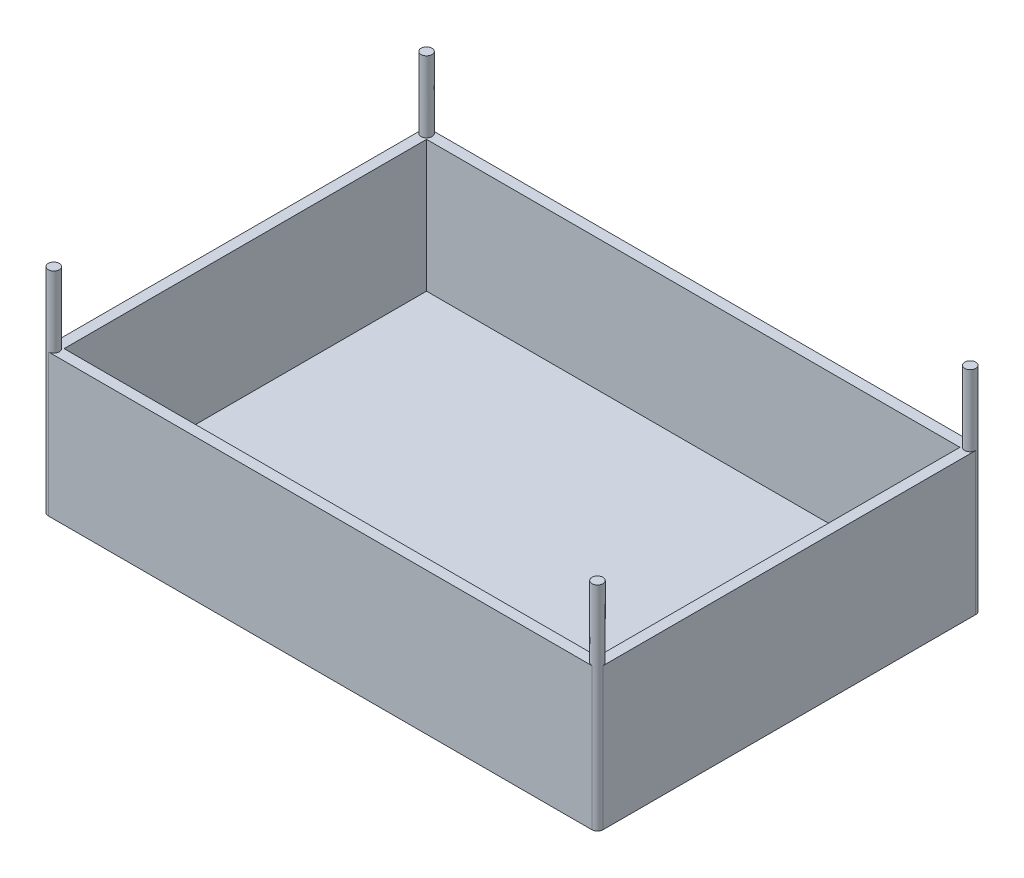
ISO-10303-21;
HEADER;
FILE_DESCRIPTION(('STEP AP214'),'2;1');
FILE_NAME('part.step','',(''),(''),'','','');
FILE_SCHEMA(('AUTOMOTIVE_DESIGN { 1 0 10303 214 1 1 1 1 }'));
ENDSEC;
DATA;
#1=APPLICATION_CONTEXT('core data for automotive mechanical design processes');
#2=APPLICATION_PROTOCOL_DEFINITION('international standard','automotive_design',2000,#1);
#3=PRODUCT_CONTEXT('',#1,'mechanical');
#4=PRODUCT('Part','Part','',(#3));
#5=PRODUCT_RELATED_PRODUCT_CATEGORY('part','',(#4));
#6=PRODUCT_DEFINITION_FORMATION('','',#4);
#7=PRODUCT_DEFINITION_CONTEXT('part definition',#1,'design');
#8=PRODUCT_DEFINITION('design','',#6,#7);
#9=PRODUCT_DEFINITION_SHAPE('','',#8);
#10=(LENGTH_UNIT() NAMED_UNIT(*) SI_UNIT(.MILLI.,.METRE.));
#11=(NAMED_UNIT(*) PLANE_ANGLE_UNIT() SI_UNIT($,.RADIAN.));
#12=(NAMED_UNIT(*) SI_UNIT($,.STERADIAN.) SOLID_ANGLE_UNIT());
#13=UNCERTAINTY_MEASURE_WITH_UNIT(LENGTH_MEASURE(1.E-05),#10,'distance_accuracy_value','');
#14=(GEOMETRIC_REPRESENTATION_CONTEXT(3) GLOBAL_UNCERTAINTY_ASSIGNED_CONTEXT((#13)) GLOBAL_UNIT_ASSIGNED_CONTEXT((#10,
#11,#12)) REPRESENTATION_CONTEXT('',''));
#15=CARTESIAN_POINT('',(0.,0.,0.));
#16=DIRECTION('',(0.,0.,1.));
#17=DIRECTION('',(1.,0.,0.));
#18=AXIS2_PLACEMENT_3D('',#15,#16,#17);
#19=CARTESIAN_POINT('',(-76.5,40.,-52.45));
#20=DIRECTION('',(0.,-1.,0.));
#21=DIRECTION('',(0.,0.,-1.));
#22=AXIS2_PLACEMENT_3D('',#19,#20,#21);
#23=PLANE('',#22);
#24=CARTESIAN_POINT('',(-76.5,40.,52.45));
#25=DIRECTION('',(0.,-1.,0.));
#26=DIRECTION('',(0.,0.,-1.));
#27=AXIS2_PLACEMENT_3D('',#24,#25,#26);
#28=CIRCLE('',#27,1.54999999999999);
#29=CARTESIAN_POINT('',(-76.4999999999999,40.,54.));
#30=VERTEX_POINT('',#29);
#31=CARTESIAN_POINT('',(-78.05,40.,52.45));
#32=VERTEX_POINT('',#31);
#33=EDGE_CURVE('E161',#30,#32,#28,.F.);
#34=ORIENTED_EDGE('',*,*,#33,.F.);
#35=DIRECTION('',(1.,0.,0.));
#36=VECTOR('',#35,1.);
#37=CARTESIAN_POINT('',(-76.5,40.,54.));
#38=LINE('',#37,#36);
#39=CARTESIAN_POINT('',(76.5,40.,54.));
#40=VERTEX_POINT('',#39);
#41=EDGE_CURVE('E206',#30,#40,#38,.T.);
#42=ORIENTED_EDGE('',*,*,#41,.T.);
#43=CARTESIAN_POINT('',(76.5,40.,52.45));
#44=DIRECTION('',(0.,-1.,0.));
#45=DIRECTION('',(0.,0.,-1.));
#46=AXIS2_PLACEMENT_3D('',#43,#44,#45);
#47=CIRCLE('',#46,1.54999999999999);
#48=CARTESIAN_POINT('',(78.05,40.,52.45));
#49=VERTEX_POINT('',#48);
#50=EDGE_CURVE('E189',#49,#40,#47,.F.);
#51=ORIENTED_EDGE('',*,*,#50,.F.);
#52=DIRECTION('',(0.,0.,-1.));
#53=VECTOR('',#52,1.);
#54=CARTESIAN_POINT('',(78.05,40.,52.45));
#55=LINE('',#54,#53);
#56=CARTESIAN_POINT('',(78.05,40.,-52.45));
#57=VERTEX_POINT('',#56);
#58=EDGE_CURVE('E211',#49,#57,#55,.T.);
#59=ORIENTED_EDGE('',*,*,#58,.T.);
#60=CARTESIAN_POINT('',(76.5,40.,-52.45));
#61=DIRECTION('',(0.,-1.,0.));
#62=DIRECTION('',(0.,0.,-1.));
#63=AXIS2_PLACEMENT_3D('',#60,#61,#62);
#64=CIRCLE('',#63,1.54999999999999);
#65=CARTESIAN_POINT('',(76.5,40.,-54.));
#66=VERTEX_POINT('',#65);
#67=EDGE_CURVE('E197',#66,#57,#64,.F.);
#68=ORIENTED_EDGE('',*,*,#67,.F.);
#69=DIRECTION('',(-1.,0.,0.));
#70=VECTOR('',#69,1.);
#71=CARTESIAN_POINT('',(76.5,40.,-54.));
#72=LINE('',#71,#70);
#73=CARTESIAN_POINT('',(-76.5,40.,-54.));
#74=VERTEX_POINT('',#73);
#75=EDGE_CURVE('E214',#66,#74,#72,.T.);
#76=ORIENTED_EDGE('',*,*,#75,.T.);
#77=CARTESIAN_POINT('',(-76.5,40.,-52.45));
#78=DIRECTION('',(0.,-1.,0.));
#79=DIRECTION('',(0.,0.,-1.));
#80=AXIS2_PLACEMENT_3D('',#77,#78,#79);
#81=CIRCLE('',#80,1.54999999999999);
#82=CARTESIAN_POINT('',(-78.05,40.,-52.45));
#83=VERTEX_POINT('',#82);
#84=EDGE_CURVE('E11',#74,#83,#81,.T.);
#85=ORIENTED_EDGE('',*,*,#84,.T.);
#86=DIRECTION('',(0.,0.,1.));
#87=VECTOR('',#86,1.);
#88=CARTESIAN_POINT('',(-78.05,40.,-52.45));
#89=LINE('',#88,#87);
#90=EDGE_CURVE('E202',#83,#32,#89,.T.);
#91=ORIENTED_EDGE('',*,*,#90,.T.);
#92=EDGE_LOOP('',(#34,#42,#51,#59,#68,#76,#85,#91));
#93=FACE_BOUND('',#92,.T.);
#94=DIRECTION('',(0.,0.,1.));
#95=VECTOR('',#94,1.);
#96=CARTESIAN_POINT('',(-75.05,40.,-52.45));
#97=LINE('',#96,#95);
#98=CARTESIAN_POINT('',(-75.05,40.,-51.));
#99=VERTEX_POINT('',#98);
#100=CARTESIAN_POINT('',(-75.05,40.,51.));
#101=VERTEX_POINT('',#100);
#102=EDGE_CURVE('E153',#99,#101,#97,.T.);
#103=ORIENTED_EDGE('',*,*,#102,.F.);
#104=DIRECTION('',(-1.,0.,0.));
#105=VECTOR('',#104,1.);
#106=CARTESIAN_POINT('',(-76.5,40.,-51.));
#107=LINE('',#106,#105);
#108=CARTESIAN_POINT('',(75.05,40.,-51.));
#109=VERTEX_POINT('',#108);
#110=EDGE_CURVE('E169',#109,#99,#107,.T.);
#111=ORIENTED_EDGE('',*,*,#110,.F.);
#112=DIRECTION('',(0.,0.,-1.));
#113=VECTOR('',#112,1.);
#114=CARTESIAN_POINT('',(75.05,40.,-52.45));
#115=LINE('',#114,#113);
#116=CARTESIAN_POINT('',(75.05,40.,51.));
#117=VERTEX_POINT('',#116);
#118=EDGE_CURVE('E177',#117,#109,#115,.T.);
#119=ORIENTED_EDGE('',*,*,#118,.F.);
#120=DIRECTION('',(1.,0.,0.));
#121=VECTOR('',#120,1.);
#122=CARTESIAN_POINT('',(-76.5,40.,51.));
#123=LINE('',#122,#121);
#124=EDGE_CURVE('E174',#101,#117,#123,.T.);
#125=ORIENTED_EDGE('',*,*,#124,.F.);
#126=EDGE_LOOP('',(#103,#111,#119,#125));
#127=FACE_BOUND('',#126,.T.);
#128=ADVANCED_FACE('F39',(#93,#127),#23,.F.);
#129=CARTESIAN_POINT('',(-76.5,60.,-52.45));
#130=DIRECTION('',(0.,-1.,0.));
#131=DIRECTION('',(0.,0.,-1.));
#132=AXIS2_PLACEMENT_3D('',#129,#130,#131);
#133=CYLINDRICAL_SURFACE('',#132,1.54999999999999);
#134=CARTESIAN_POINT('',(-76.5,60.,-52.45));
#135=DIRECTION('',(0.,1.,0.));
#136=DIRECTION('',(0.,0.,1.));
#137=AXIS2_PLACEMENT_3D('',#134,#135,#136);
#138=CIRCLE('',#137,1.54999999999999);
#139=CARTESIAN_POINT('',(-76.5,60.,-50.9));
#140=VERTEX_POINT('',#139);
#141=EDGE_CURVE('E48',#140,#140,#138,.T.);
#142=ORIENTED_EDGE('',*,*,#141,.F.);
#143=EDGE_LOOP('',(#142));
#144=FACE_BOUND('',#143,.T.);
#145=ORIENTED_EDGE('',*,*,#84,.F.);
#146=DIRECTION('',(0.,-1.,0.));
#147=VECTOR('',#146,1.);
#148=CARTESIAN_POINT('',(-76.5,40.,-54.));
#149=LINE('',#148,#147);
#150=CARTESIAN_POINT('',(-76.5,0.,-54.));
#151=VERTEX_POINT('',#150);
#152=EDGE_CURVE('E217',#74,#151,#149,.T.);
#153=ORIENTED_EDGE('',*,*,#152,.T.);
#154=CARTESIAN_POINT('',(-76.5,0.,-52.45));
#155=DIRECTION('',(0.,1.,0.));
#156=DIRECTION('',(0.,0.,1.));
#157=AXIS2_PLACEMENT_3D('',#154,#155,#156);
#158=CIRCLE('',#157,1.54999999999999);
#159=CARTESIAN_POINT('',(-78.05,0.,-52.45));
#160=VERTEX_POINT('',#159);
#161=EDGE_CURVE('E268',#151,#160,#158,.T.);
#162=ORIENTED_EDGE('',*,*,#161,.T.);
#163=DIRECTION('',(0.,-1.,0.));
#164=VECTOR('',#163,1.);
#165=CARTESIAN_POINT('',(-78.05,40.,-52.45));
#166=LINE('',#165,#164);
#167=EDGE_CURVE('E264',#83,#160,#166,.T.);
#168=ORIENTED_EDGE('',*,*,#167,.F.);
#169=EDGE_LOOP('',(#145,#153,#162,#168));
#170=FACE_BOUND('',#169,.T.);
#171=ADVANCED_FACE('F41',(#144,#170),#133,.T.);
#172=CARTESIAN_POINT('',(-76.5,60.,-52.45));
#173=DIRECTION('',(0.,1.,0.));
#174=DIRECTION('',(0.,0.,1.));
#175=AXIS2_PLACEMENT_3D('',#172,#173,#174);
#176=PLANE('',#175);
#177=ORIENTED_EDGE('',*,*,#141,.T.);
#178=EDGE_LOOP('',(#177));
#179=FACE_BOUND('',#178,.T.);
#180=ADVANCED_FACE('F325',(#179),#176,.T.);
#181=CARTESIAN_POINT('',(-76.5,0.,-52.45));
#182=DIRECTION('',(0.,1.,0.));
#183=DIRECTION('',(0.,0.,1.));
#184=AXIS2_PLACEMENT_3D('',#181,#182,#183);
#185=PLANE('',#184);
#186=DIRECTION('',(1.,0.,0.));
#187=VECTOR('',#186,1.);
#188=CARTESIAN_POINT('',(-76.5,0.,54.));
#189=LINE('',#188,#187);
#190=CARTESIAN_POINT('',(-76.4999999999999,0.,54.));
#191=VERTEX_POINT('',#190);
#192=CARTESIAN_POINT('',(76.5,0.,54.));
#193=VERTEX_POINT('',#192);
#194=EDGE_CURVE('E223',#191,#193,#189,.T.);
#195=ORIENTED_EDGE('',*,*,#194,.F.);
#196=CARTESIAN_POINT('',(-76.4999999999999,0.,52.4499999999999));
#197=DIRECTION('',(0.,1.,0.));
#198=DIRECTION('',(0.,0.,1.));
#199=AXIS2_PLACEMENT_3D('',#196,#197,#198);
#200=CIRCLE('',#199,1.55000000000009);
#201=CARTESIAN_POINT('',(-78.05,0.,52.45));
#202=VERTEX_POINT('',#201);
#203=EDGE_CURVE('E220',#202,#191,#200,.T.);
#204=ORIENTED_EDGE('',*,*,#203,.F.);
#205=DIRECTION('',(0.,0.,1.));
#206=VECTOR('',#205,1.);
#207=CARTESIAN_POINT('',(-78.05,0.,-52.45));
#208=LINE('',#207,#206);
#209=EDGE_CURVE('E201',#160,#202,#208,.T.);
#210=ORIENTED_EDGE('',*,*,#209,.F.);
#211=ORIENTED_EDGE('',*,*,#161,.F.);
#212=DIRECTION('',(-1.,0.,0.));
#213=VECTOR('',#212,1.);
#214=CARTESIAN_POINT('',(76.5,0.,-54.));
#215=LINE('',#214,#213);
#216=CARTESIAN_POINT('',(76.5,0.,-54.));
#217=VERTEX_POINT('',#216);
#218=EDGE_CURVE('E207',#217,#151,#215,.T.);
#219=ORIENTED_EDGE('',*,*,#218,.F.);
#220=CARTESIAN_POINT('',(76.4999999999984,0.,-52.4499999999984));
#221=DIRECTION('',(0.,1.,0.));
#222=DIRECTION('',(0.,0.,-1.));
#223=AXIS2_PLACEMENT_3D('',#220,#221,#222);
#224=CIRCLE('',#223,1.55000000000161);
#225=CARTESIAN_POINT('',(78.05,0.,-52.45));
#226=VERTEX_POINT('',#225);
#227=EDGE_CURVE('E232',#226,#217,#224,.T.);
#228=ORIENTED_EDGE('',*,*,#227,.F.);
#229=DIRECTION('',(0.,0.,-1.));
#230=VECTOR('',#229,1.);
#231=CARTESIAN_POINT('',(78.05,0.,52.45));
#232=LINE('',#231,#230);
#233=CARTESIAN_POINT('',(78.05,0.,52.45));
#234=VERTEX_POINT('',#233);
#235=EDGE_CURVE('E229',#234,#226,#232,.T.);
#236=ORIENTED_EDGE('',*,*,#235,.F.);
#237=CARTESIAN_POINT('',(76.4999999999987,0.,52.4499999999987));
#238=DIRECTION('',(0.,1.,0.));
#239=DIRECTION('',(0.,0.,-1.));
#240=AXIS2_PLACEMENT_3D('',#237,#238,#239);
#241=CIRCLE('',#240,1.55000000000125);
#242=EDGE_CURVE('E226',#193,#234,#241,.T.);
#243=ORIENTED_EDGE('',*,*,#242,.F.);
#244=EDGE_LOOP('',(#195,#204,#210,#211,#219,#228,#236,#243));
#245=FACE_BOUND('',#244,.T.);
#246=ADVANCED_FACE('F278',(#245),#185,.F.);
#247=CARTESIAN_POINT('',(-78.05,40.,-52.45));
#248=DIRECTION('',(1.,0.,0.));
#249=DIRECTION('',(0.,0.,-1.));
#250=AXIS2_PLACEMENT_3D('',#247,#248,#249);
#251=PLANE('',#250);
#252=ORIENTED_EDGE('',*,*,#209,.T.);
#253=DIRECTION('',(0.,-1.,0.));
#254=VECTOR('',#253,1.);
#255=CARTESIAN_POINT('',(-78.05,40.,52.45));
#256=LINE('',#255,#254);
#257=EDGE_CURVE('E260',#32,#202,#256,.T.);
#258=ORIENTED_EDGE('',*,*,#257,.F.);
#259=ORIENTED_EDGE('',*,*,#90,.F.);
#260=ORIENTED_EDGE('',*,*,#167,.T.);
#261=EDGE_LOOP('',(#252,#258,#259,#260));
#262=FACE_BOUND('',#261,.T.);
#263=ADVANCED_FACE('F281',(#262),#251,.F.);
#264=CARTESIAN_POINT('',(-76.4999999999999,40.,52.4499999999999));
#265=DIRECTION('',(0.,-1.,0.));
#266=DIRECTION('',(0.,0.,-1.));
#267=AXIS2_PLACEMENT_3D('',#264,#265,#266);
#268=CYLINDRICAL_SURFACE('',#267,1.55000000000009);
#269=ORIENTED_EDGE('',*,*,#203,.T.);
#270=DIRECTION('',(0.,-1.,0.));
#271=VECTOR('',#270,1.);
#272=CARTESIAN_POINT('',(-76.4999999999999,40.,54.));
#273=LINE('',#272,#271);
#274=EDGE_CURVE('E256',#30,#191,#273,.T.);
#275=ORIENTED_EDGE('',*,*,#274,.F.);
#276=ORIENTED_EDGE('',*,*,#33,.T.);
#277=ORIENTED_EDGE('',*,*,#257,.T.);
#278=EDGE_LOOP('',(#269,#275,#276,#277));
#279=FACE_BOUND('',#278,.T.);
#280=CARTESIAN_POINT('',(-76.5,60.,52.45));
#281=DIRECTION('',(0.,1.,0.));
#282=DIRECTION('',(0.,0.,1.));
#283=AXIS2_PLACEMENT_3D('',#280,#281,#282);
#284=CIRCLE('',#283,1.54999999999999);
#285=CARTESIAN_POINT('',(-76.5,60.,54.));
#286=VERTEX_POINT('',#285);
#287=EDGE_CURVE('E155',#286,#286,#284,.T.);
#288=ORIENTED_EDGE('',*,*,#287,.F.);
#289=EDGE_LOOP('',(#288));
#290=FACE_BOUND('',#289,.T.);
#291=ADVANCED_FACE('F286',(#279,#290),#268,.T.);
#292=CARTESIAN_POINT('',(-76.5,40.,54.));
#293=DIRECTION('',(0.,0.,-1.));
#294=DIRECTION('',(-1.,0.,0.));
#295=AXIS2_PLACEMENT_3D('',#292,#293,#294);
#296=PLANE('',#295);
#297=ORIENTED_EDGE('',*,*,#194,.T.);
#298=DIRECTION('',(0.,-1.,0.));
#299=VECTOR('',#298,1.);
#300=CARTESIAN_POINT('',(76.5,40.,54.));
#301=LINE('',#300,#299);
#302=EDGE_CURVE('E252',#40,#193,#301,.T.);
#303=ORIENTED_EDGE('',*,*,#302,.F.);
#304=ORIENTED_EDGE('',*,*,#41,.F.);
#305=ORIENTED_EDGE('',*,*,#274,.T.);
#306=EDGE_LOOP('',(#297,#303,#304,#305));
#307=FACE_BOUND('',#306,.T.);
#308=ADVANCED_FACE('F290',(#307),#296,.F.);
#309=CARTESIAN_POINT('',(76.4999999999987,40.,52.4499999999987));
#310=DIRECTION('',(0.,-1.,0.));
#311=DIRECTION('',(0.,0.,-1.));
#312=AXIS2_PLACEMENT_3D('',#309,#310,#311);
#313=CYLINDRICAL_SURFACE('',#312,1.55000000000125);
#314=ORIENTED_EDGE('',*,*,#242,.T.);
#315=DIRECTION('',(0.,-1.,0.));
#316=VECTOR('',#315,1.);
#317=CARTESIAN_POINT('',(78.05,40.,52.45));
#318=LINE('',#317,#316);
#319=EDGE_CURVE('E248',#49,#234,#318,.T.);
#320=ORIENTED_EDGE('',*,*,#319,.F.);
#321=ORIENTED_EDGE('',*,*,#50,.T.);
#322=ORIENTED_EDGE('',*,*,#302,.T.);
#323=EDGE_LOOP('',(#314,#320,#321,#322));
#324=FACE_BOUND('',#323,.T.);
#325=CARTESIAN_POINT('',(76.5,60.,52.45));
#326=DIRECTION('',(0.,1.,0.));
#327=DIRECTION('',(0.,0.,1.));
#328=AXIS2_PLACEMENT_3D('',#325,#326,#327);
#329=CIRCLE('',#328,1.54999999999999);
#330=CARTESIAN_POINT('',(76.5,60.,54.));
#331=VERTEX_POINT('',#330);
#332=EDGE_CURVE('E185',#331,#331,#329,.T.);
#333=ORIENTED_EDGE('',*,*,#332,.F.);
#334=EDGE_LOOP('',(#333));
#335=FACE_BOUND('',#334,.T.);
#336=ADVANCED_FACE('F293',(#324,#335),#313,.T.);
#337=CARTESIAN_POINT('',(78.05,40.,52.45));
#338=DIRECTION('',(-1.,0.,0.));
#339=DIRECTION('',(0.,0.,1.));
#340=AXIS2_PLACEMENT_3D('',#337,#338,#339);
#341=PLANE('',#340);
#342=ORIENTED_EDGE('',*,*,#235,.T.);
#343=DIRECTION('',(0.,-1.,0.));
#344=VECTOR('',#343,1.);
#345=CARTESIAN_POINT('',(78.05,40.,-52.45));
#346=LINE('',#345,#344);
#347=EDGE_CURVE('E244',#57,#226,#346,.T.);
#348=ORIENTED_EDGE('',*,*,#347,.F.);
#349=ORIENTED_EDGE('',*,*,#58,.F.);
#350=ORIENTED_EDGE('',*,*,#319,.T.);
#351=EDGE_LOOP('',(#342,#348,#349,#350));
#352=FACE_BOUND('',#351,.T.);
#353=ADVANCED_FACE('F300',(#352),#341,.F.);
#354=CARTESIAN_POINT('',(76.4999999999984,40.,-52.4499999999984));
#355=DIRECTION('',(0.,-1.,0.));
#356=DIRECTION('',(0.,0.,-1.));
#357=AXIS2_PLACEMENT_3D('',#354,#355,#356);
#358=CYLINDRICAL_SURFACE('',#357,1.55000000000161);
#359=ORIENTED_EDGE('',*,*,#227,.T.);
#360=DIRECTION('',(0.,-1.,0.));
#361=VECTOR('',#360,1.);
#362=CARTESIAN_POINT('',(76.5,40.,-54.));
#363=LINE('',#362,#361);
#364=EDGE_CURVE('E240',#66,#217,#363,.T.);
#365=ORIENTED_EDGE('',*,*,#364,.F.);
#366=ORIENTED_EDGE('',*,*,#67,.T.);
#367=ORIENTED_EDGE('',*,*,#347,.T.);
#368=EDGE_LOOP('',(#359,#365,#366,#367));
#369=FACE_BOUND('',#368,.T.);
#370=CARTESIAN_POINT('',(76.5,60.,-52.45));
#371=DIRECTION('',(0.,1.,0.));
#372=DIRECTION('',(0.,0.,1.));
#373=AXIS2_PLACEMENT_3D('',#370,#371,#372);
#374=CIRCLE('',#373,1.54999999999999);
#375=CARTESIAN_POINT('',(76.5,60.,-50.9));
#376=VERTEX_POINT('',#375);
#377=EDGE_CURVE('E193',#376,#376,#374,.T.);
#378=ORIENTED_EDGE('',*,*,#377,.F.);
#379=EDGE_LOOP('',(#378));
#380=FACE_BOUND('',#379,.T.);
#381=ADVANCED_FACE('F304',(#369,#380),#358,.T.);
#382=CARTESIAN_POINT('',(76.5,40.,-54.));
#383=DIRECTION('',(0.,0.,1.));
#384=DIRECTION('',(1.,0.,0.));
#385=AXIS2_PLACEMENT_3D('',#382,#383,#384);
#386=PLANE('',#385);
#387=ORIENTED_EDGE('',*,*,#218,.T.);
#388=ORIENTED_EDGE('',*,*,#152,.F.);
#389=ORIENTED_EDGE('',*,*,#75,.F.);
#390=ORIENTED_EDGE('',*,*,#364,.T.);
#391=EDGE_LOOP('',(#387,#388,#389,#390));
#392=FACE_BOUND('',#391,.T.);
#393=ADVANCED_FACE('F308',(#392),#386,.F.);
#394=CARTESIAN_POINT('',(76.5,60.,-52.45));
#395=DIRECTION('',(0.,1.,0.));
#396=DIRECTION('',(0.,0.,1.));
#397=AXIS2_PLACEMENT_3D('',#394,#395,#396);
#398=PLANE('',#397);
#399=ORIENTED_EDGE('',*,*,#377,.T.);
#400=EDGE_LOOP('',(#399));
#401=FACE_BOUND('',#400,.T.);
#402=ADVANCED_FACE('F310',(#401),#398,.T.);
#403=CARTESIAN_POINT('',(76.5,60.,52.45));
#404=DIRECTION('',(0.,1.,0.));
#405=DIRECTION('',(0.,0.,1.));
#406=AXIS2_PLACEMENT_3D('',#403,#404,#405);
#407=PLANE('',#406);
#408=ORIENTED_EDGE('',*,*,#332,.T.);
#409=EDGE_LOOP('',(#408));
#410=FACE_BOUND('',#409,.T.);
#411=ADVANCED_FACE('F316',(#410),#407,.T.);
#412=CARTESIAN_POINT('',(-76.5,60.,52.45));
#413=DIRECTION('',(0.,1.,0.));
#414=DIRECTION('',(0.,0.,1.));
#415=AXIS2_PLACEMENT_3D('',#412,#413,#414);
#416=PLANE('',#415);
#417=ORIENTED_EDGE('',*,*,#287,.T.);
#418=EDGE_LOOP('',(#417));
#419=FACE_BOUND('',#418,.T.);
#420=ADVANCED_FACE('F330',(#419),#416,.T.);
#421=CARTESIAN_POINT('',(-76.5,3.,-52.45));
#422=DIRECTION('',(0.,1.,0.));
#423=DIRECTION('',(0.,0.,1.));
#424=AXIS2_PLACEMENT_3D('',#421,#422,#423);
#425=PLANE('',#424);
#426=DIRECTION('',(1.,0.,0.));
#427=VECTOR('',#426,1.);
#428=CARTESIAN_POINT('',(-76.5,3.,51.));
#429=LINE('',#428,#427);
#430=CARTESIAN_POINT('',(-75.05,3.,51.));
#431=VERTEX_POINT('',#430);
#432=CARTESIAN_POINT('',(75.05,3.,51.));
#433=VERTEX_POINT('',#432);
#434=EDGE_CURVE('E129',#431,#433,#429,.T.);
#435=ORIENTED_EDGE('',*,*,#434,.T.);
#436=DIRECTION('',(0.,0.,-1.));
#437=VECTOR('',#436,1.);
#438=CARTESIAN_POINT('',(75.05,3.,52.45));
#439=LINE('',#438,#437);
#440=CARTESIAN_POINT('',(75.05,3.,-51.));
#441=VERTEX_POINT('',#440);
#442=EDGE_CURVE('E140',#433,#441,#439,.T.);
#443=ORIENTED_EDGE('',*,*,#442,.T.);
#444=DIRECTION('',(-1.,0.,0.));
#445=VECTOR('',#444,1.);
#446=CARTESIAN_POINT('',(76.5,3.,-51.));
#447=LINE('',#446,#445);
#448=CARTESIAN_POINT('',(-75.05,3.,-51.));
#449=VERTEX_POINT('',#448);
#450=EDGE_CURVE('E145',#441,#449,#447,.T.);
#451=ORIENTED_EDGE('',*,*,#450,.T.);
#452=DIRECTION('',(0.,0.,1.));
#453=VECTOR('',#452,1.);
#454=CARTESIAN_POINT('',(-75.05,3.,-52.45));
#455=LINE('',#454,#453);
#456=EDGE_CURVE('E141',#449,#431,#455,.T.);
#457=ORIENTED_EDGE('',*,*,#456,.T.);
#458=EDGE_LOOP('',(#435,#443,#451,#457));
#459=FACE_BOUND('',#458,.T.);
#460=ADVANCED_FACE('F144',(#459),#425,.T.);
#461=CARTESIAN_POINT('',(-75.05,40.,-52.45));
#462=DIRECTION('',(1.,0.,0.));
#463=DIRECTION('',(0.,0.,-1.));
#464=AXIS2_PLACEMENT_3D('',#461,#462,#463);
#465=PLANE('',#464);
#466=ORIENTED_EDGE('',*,*,#456,.F.);
#467=DIRECTION('',(0.,1.,0.));
#468=VECTOR('',#467,1.);
#469=CARTESIAN_POINT('',(-75.05,40.,-51.));
#470=LINE('',#469,#468);
#471=EDGE_CURVE('E156',#449,#99,#470,.T.);
#472=ORIENTED_EDGE('',*,*,#471,.T.);
#473=ORIENTED_EDGE('',*,*,#102,.T.);
#474=DIRECTION('',(0.,-1.,0.));
#475=VECTOR('',#474,1.);
#476=CARTESIAN_POINT('',(-75.05,40.,51.));
#477=LINE('',#476,#475);
#478=EDGE_CURVE('E133',#101,#431,#477,.T.);
#479=ORIENTED_EDGE('',*,*,#478,.T.);
#480=EDGE_LOOP('',(#466,#472,#473,#479));
#481=FACE_BOUND('',#480,.T.);
#482=ADVANCED_FACE('F151',(#481),#465,.T.);
#483=CARTESIAN_POINT('',(-76.5,40.,51.));
#484=DIRECTION('',(0.,0.,-1.));
#485=DIRECTION('',(-1.,0.,0.));
#486=AXIS2_PLACEMENT_3D('',#483,#484,#485);
#487=PLANE('',#486);
#488=ORIENTED_EDGE('',*,*,#434,.F.);
#489=ORIENTED_EDGE('',*,*,#478,.F.);
#490=ORIENTED_EDGE('',*,*,#124,.T.);
#491=DIRECTION('',(0.,-1.,0.));
#492=VECTOR('',#491,1.);
#493=CARTESIAN_POINT('',(75.05,40.,51.));
#494=LINE('',#493,#492);
#495=EDGE_CURVE('E136',#117,#433,#494,.T.);
#496=ORIENTED_EDGE('',*,*,#495,.T.);
#497=EDGE_LOOP('',(#488,#489,#490,#496));
#498=FACE_BOUND('',#497,.T.);
#499=ADVANCED_FACE('F131',(#498),#487,.T.);
#500=CARTESIAN_POINT('',(75.05,40.,52.45));
#501=DIRECTION('',(-1.,0.,0.));
#502=DIRECTION('',(0.,0.,1.));
#503=AXIS2_PLACEMENT_3D('',#500,#501,#502);
#504=PLANE('',#503);
#505=ORIENTED_EDGE('',*,*,#442,.F.);
#506=ORIENTED_EDGE('',*,*,#495,.F.);
#507=ORIENTED_EDGE('',*,*,#118,.T.);
#508=DIRECTION('',(0.,-1.,0.));
#509=VECTOR('',#508,1.);
#510=CARTESIAN_POINT('',(75.05,40.,-51.));
#511=LINE('',#510,#509);
#512=EDGE_CURVE('E55',#109,#441,#511,.T.);
#513=ORIENTED_EDGE('',*,*,#512,.T.);
#514=EDGE_LOOP('',(#505,#506,#507,#513));
#515=FACE_BOUND('',#514,.T.);
#516=ADVANCED_FACE('F338',(#515),#504,.T.);
#517=CARTESIAN_POINT('',(76.5,40.,-51.));
#518=DIRECTION('',(0.,0.,1.));
#519=DIRECTION('',(1.,0.,0.));
#520=AXIS2_PLACEMENT_3D('',#517,#518,#519);
#521=PLANE('',#520);
#522=ORIENTED_EDGE('',*,*,#450,.F.);
#523=ORIENTED_EDGE('',*,*,#512,.F.);
#524=ORIENTED_EDGE('',*,*,#110,.T.);
#525=ORIENTED_EDGE('',*,*,#471,.F.);
#526=EDGE_LOOP('',(#522,#523,#524,#525));
#527=FACE_BOUND('',#526,.T.);
#528=ADVANCED_FACE('F335',(#527),#521,.T.);
#529=CLOSED_SHELL('',(#128,#171,#180,#246,#263,#291,#308,#336,#353,#381,#393,#402,#411,#420,
#460,#482,#499,#516,#528));
#530=MANIFOLD_SOLID_BREP('B2',#529);
#531=ADVANCED_BREP_SHAPE_REPRESENTATION('',(#18,#530),#14);
#532=SHAPE_DEFINITION_REPRESENTATION(#9,#531);
ENDSEC;
END-ISO-10303-21;
